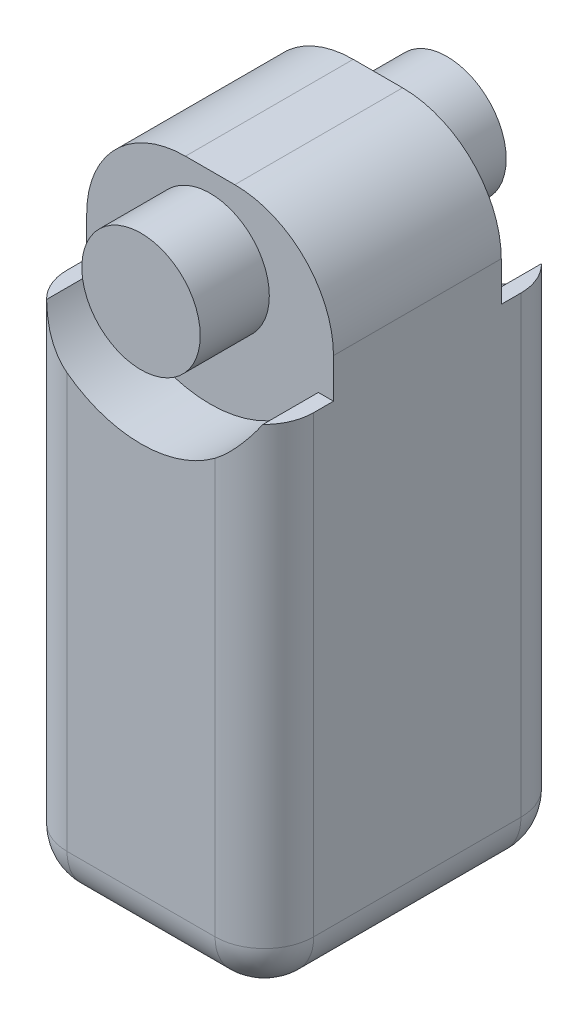
ISO-10303-21;
HEADER;
FILE_DESCRIPTION(('STEP AP214'),'2;1');
FILE_NAME('part.step','',(''),(''),'','','');
FILE_SCHEMA(('AUTOMOTIVE_DESIGN { 1 0 10303 214 1 1 1 1 }'));
ENDSEC;
DATA;
#1=APPLICATION_CONTEXT('core data for automotive mechanical design processes');
#2=APPLICATION_PROTOCOL_DEFINITION('international standard','automotive_design',2000,#1);
#3=PRODUCT_CONTEXT('',#1,'mechanical');
#4=PRODUCT('Part','Part','',(#3));
#5=PRODUCT_RELATED_PRODUCT_CATEGORY('part','',(#4));
#6=PRODUCT_DEFINITION_FORMATION('','',#4);
#7=PRODUCT_DEFINITION_CONTEXT('part definition',#1,'design');
#8=PRODUCT_DEFINITION('design','',#6,#7);
#9=PRODUCT_DEFINITION_SHAPE('','',#8);
#10=(LENGTH_UNIT() NAMED_UNIT(*) SI_UNIT(.MILLI.,.METRE.));
#11=(NAMED_UNIT(*) PLANE_ANGLE_UNIT() SI_UNIT($,.RADIAN.));
#12=(NAMED_UNIT(*) SI_UNIT($,.STERADIAN.) SOLID_ANGLE_UNIT());
#13=UNCERTAINTY_MEASURE_WITH_UNIT(LENGTH_MEASURE(1.E-05),#10,'distance_accuracy_value','');
#14=(GEOMETRIC_REPRESENTATION_CONTEXT(3) GLOBAL_UNCERTAINTY_ASSIGNED_CONTEXT((#13)) GLOBAL_UNIT_ASSIGNED_CONTEXT((#10,
#11,#12)) REPRESENTATION_CONTEXT('',''));
#15=CARTESIAN_POINT('',(0.,0.,0.));
#16=DIRECTION('',(0.,0.,1.));
#17=DIRECTION('',(1.,0.,0.));
#18=AXIS2_PLACEMENT_3D('',#15,#16,#17);
#19=CARTESIAN_POINT('',(-2.26904801141879,17.2601516919487,15.5));
#20=DIRECTION('',(0.,-1.,0.));
#21=DIRECTION('',(0.,0.,-1.));
#22=AXIS2_PLACEMENT_3D('',#19,#20,#21);
#23=PLANE('',#22);
#24=DIRECTION('',(1.,0.,0.));
#25=VECTOR('',#24,1.);
#26=CARTESIAN_POINT('',(-2.26904801141879,17.2601516919487,-8.5));
#27=LINE('',#26,#25);
#28=CARTESIAN_POINT('',(7.73095198858121,17.2601516919487,-8.5));
#29=VERTEX_POINT('',#28);
#30=CARTESIAN_POINT('',(12.7309519885812,17.2601516919487,-8.5));
#31=VERTEX_POINT('',#30);
#32=EDGE_CURVE('E224',#29,#31,#27,.T.);
#33=ORIENTED_EDGE('',*,*,#32,.F.);
#34=DIRECTION('',(0.,0.,-1.));
#35=VECTOR('',#34,1.);
#36=CARTESIAN_POINT('',(7.73095198858121,17.2601516919487,15.5));
#37=LINE('',#36,#35);
#38=CARTESIAN_POINT('',(7.73095198858121,17.2601516919487,8.5));
#39=VERTEX_POINT('',#38);
#40=EDGE_CURVE('E292',#29,#39,#37,.F.);
#41=ORIENTED_EDGE('',*,*,#40,.T.);
#42=DIRECTION('',(-1.,0.,0.));
#43=VECTOR('',#42,1.);
#44=CARTESIAN_POINT('',(-2.26904801141879,17.2601516919487,8.5));
#45=LINE('',#44,#43);
#46=CARTESIAN_POINT('',(12.7309519885812,17.2601516919487,8.5));
#47=VERTEX_POINT('',#46);
#48=EDGE_CURVE('E264',#47,#39,#45,.T.);
#49=ORIENTED_EDGE('',*,*,#48,.F.);
#50=DIRECTION('',(0.,0.,-1.));
#51=VECTOR('',#50,1.);
#52=CARTESIAN_POINT('',(12.7309519885812,17.2601516919487,15.5));
#53=LINE('',#52,#51);
#54=EDGE_CURVE('E288',#47,#31,#53,.T.);
#55=ORIENTED_EDGE('',*,*,#54,.T.);
#56=EDGE_LOOP('',(#33,#41,#49,#55));
#57=FACE_BOUND('',#56,.T.);
#58=ADVANCED_FACE('F47',(#57),#23,.F.);
#59=CARTESIAN_POINT('',(-2.26904801141879,17.2601516919487,15.5));
#60=DIRECTION('',(1.,0.,0.));
#61=DIRECTION('',(0.,1.,0.));
#62=AXIS2_PLACEMENT_3D('',#59,#60,#61);
#63=PLANE('',#62);
#64=DIRECTION('',(0.,-1.,0.));
#65=VECTOR('',#64,1.);
#66=CARTESIAN_POINT('',(-2.26904801141879,17.2601516919487,-10.5));
#67=LINE('',#66,#65);
#68=CARTESIAN_POINT('',(-2.26904801141879,3.26015169194865,-10.5));
#69=VERTEX_POINT('',#68);
#70=CARTESIAN_POINT('',(-2.26904801141879,-42.7398483080514,-10.5));
#71=VERTEX_POINT('',#70);
#72=EDGE_CURVE('E509',#69,#71,#67,.T.);
#73=ORIENTED_EDGE('',*,*,#72,.T.);
#74=DIRECTION('',(0.,0.,-1.));
#75=VECTOR('',#74,1.);
#76=CARTESIAN_POINT('',(-2.26904801141879,-42.7398483080514,15.5));
#77=LINE('',#76,#75);
#78=CARTESIAN_POINT('',(-2.26904801141879,-42.7398483080513,10.5));
#79=VERTEX_POINT('',#78);
#80=EDGE_CURVE('E11',#71,#79,#77,.F.);
#81=ORIENTED_EDGE('',*,*,#80,.T.);
#82=DIRECTION('',(0.,-1.,0.));
#83=VECTOR('',#82,1.);
#84=CARTESIAN_POINT('',(-2.26904801141879,3.26015169194865,10.5));
#85=LINE('',#84,#83);
#86=CARTESIAN_POINT('',(-2.26904801141879,3.26015169194865,10.5));
#87=VERTEX_POINT('',#86);
#88=EDGE_CURVE('E519',#79,#87,#85,.F.);
#89=ORIENTED_EDGE('',*,*,#88,.T.);
#90=DIRECTION('',(0.,0.,1.));
#91=VECTOR('',#90,1.);
#92=CARTESIAN_POINT('',(-2.26904801141879,3.26015169194865,8.5));
#93=LINE('',#92,#91);
#94=CARTESIAN_POINT('',(-2.26904801141879,3.26015169194865,8.5));
#95=VERTEX_POINT('',#94);
#96=EDGE_CURVE('E256',#95,#87,#93,.T.);
#97=ORIENTED_EDGE('',*,*,#96,.F.);
#98=DIRECTION('',(0.,-1.,0.));
#99=VECTOR('',#98,1.);
#100=CARTESIAN_POINT('',(-2.26904801141879,3.26015169194865,8.5));
#101=LINE('',#100,#99);
#102=CARTESIAN_POINT('',(-2.26904801141879,7.26015169194865,8.5));
#103=VERTEX_POINT('',#102);
#104=EDGE_CURVE('E237',#103,#95,#101,.T.);
#105=ORIENTED_EDGE('',*,*,#104,.F.);
#106=DIRECTION('',(0.,0.,-1.));
#107=VECTOR('',#106,1.);
#108=CARTESIAN_POINT('',(-2.26904801141879,7.26015169194865,15.5));
#109=LINE('',#108,#107);
#110=CARTESIAN_POINT('',(-2.26904801141879,7.26015169194865,-8.5));
#111=VERTEX_POINT('',#110);
#112=EDGE_CURVE('E279',#103,#111,#109,.T.);
#113=ORIENTED_EDGE('',*,*,#112,.T.);
#114=DIRECTION('',(0.,-1.,0.));
#115=VECTOR('',#114,1.);
#116=CARTESIAN_POINT('',(-2.26904801141879,3.26015169194865,-8.5));
#117=LINE('',#116,#115);
#118=CARTESIAN_POINT('',(-2.26904801141879,3.26015169194865,-8.5));
#119=VERTEX_POINT('',#118);
#120=EDGE_CURVE('E197',#111,#119,#117,.T.);
#121=ORIENTED_EDGE('',*,*,#120,.T.);
#122=DIRECTION('',(0.,0.,-1.));
#123=VECTOR('',#122,1.);
#124=CARTESIAN_POINT('',(-2.26904801141879,3.26015169194865,-8.5));
#125=LINE('',#124,#123);
#126=EDGE_CURVE('E228',#119,#69,#125,.T.);
#127=ORIENTED_EDGE('',*,*,#126,.T.);
#128=EDGE_LOOP('',(#73,#81,#89,#97,#105,#113,#121,#127));
#129=FACE_BOUND('',#128,.T.);
#130=ADVANCED_FACE('F373',(#129),#63,.F.);
#131=CARTESIAN_POINT('',(22.7309519885812,17.2601516919487,15.5));
#132=DIRECTION('',(-1.,0.,0.));
#133=DIRECTION('',(0.,-1.,0.));
#134=AXIS2_PLACEMENT_3D('',#131,#132,#133);
#135=PLANE('',#134);
#136=DIRECTION('',(0.,1.,0.));
#137=VECTOR('',#136,1.);
#138=CARTESIAN_POINT('',(22.7309519885812,-47.7398483080514,10.5));
#139=LINE('',#138,#137);
#140=CARTESIAN_POINT('',(22.7309519885812,3.26015169194865,10.5));
#141=VERTEX_POINT('',#140);
#142=CARTESIAN_POINT('',(22.7309519885812,-42.7398483080514,10.5));
#143=VERTEX_POINT('',#142);
#144=EDGE_CURVE('E304',#141,#143,#139,.F.);
#145=ORIENTED_EDGE('',*,*,#144,.T.);
#146=DIRECTION('',(0.,0.,-1.));
#147=VECTOR('',#146,1.);
#148=CARTESIAN_POINT('',(22.7309519885812,-42.7398483080514,15.5));
#149=LINE('',#148,#147);
#150=CARTESIAN_POINT('',(22.7309519885812,-42.7398483080514,-10.5));
#151=VERTEX_POINT('',#150);
#152=EDGE_CURVE('E545',#143,#151,#149,.T.);
#153=ORIENTED_EDGE('',*,*,#152,.T.);
#154=DIRECTION('',(0.,1.,0.));
#155=VECTOR('',#154,1.);
#156=CARTESIAN_POINT('',(22.7309519885812,17.2601516919487,-10.5));
#157=LINE('',#156,#155);
#158=CARTESIAN_POINT('',(22.7309519885812,3.26015169194865,-10.5));
#159=VERTEX_POINT('',#158);
#160=EDGE_CURVE('E212',#151,#159,#157,.T.);
#161=ORIENTED_EDGE('',*,*,#160,.T.);
#162=DIRECTION('',(0.,0.,-1.));
#163=VECTOR('',#162,1.);
#164=CARTESIAN_POINT('',(22.7309519885812,3.26015169194865,-8.5));
#165=LINE('',#164,#163);
#166=CARTESIAN_POINT('',(22.7309519885812,3.26015169194865,-8.5));
#167=VERTEX_POINT('',#166);
#168=EDGE_CURVE('E203',#167,#159,#165,.T.);
#169=ORIENTED_EDGE('',*,*,#168,.F.);
#170=DIRECTION('',(0.,1.,0.));
#171=VECTOR('',#170,1.);
#172=CARTESIAN_POINT('',(22.7309519885812,26.0583208976703,-8.5));
#173=LINE('',#172,#171);
#174=CARTESIAN_POINT('',(22.7309519885812,7.26015169194865,-8.5));
#175=VERTEX_POINT('',#174);
#176=EDGE_CURVE('E185',#167,#175,#173,.T.);
#177=ORIENTED_EDGE('',*,*,#176,.T.);
#178=DIRECTION('',(0.,0.,-1.));
#179=VECTOR('',#178,1.);
#180=CARTESIAN_POINT('',(22.7309519885812,7.26015169194865,15.5));
#181=LINE('',#180,#179);
#182=CARTESIAN_POINT('',(22.7309519885812,7.26015169194865,8.5));
#183=VERTEX_POINT('',#182);
#184=EDGE_CURVE('E301',#175,#183,#181,.F.);
#185=ORIENTED_EDGE('',*,*,#184,.T.);
#186=DIRECTION('',(0.,1.,0.));
#187=VECTOR('',#186,1.);
#188=CARTESIAN_POINT('',(22.7309519885812,9.26015169194865,8.5));
#189=LINE('',#188,#187);
#190=CARTESIAN_POINT('',(22.7309519885812,3.26015169194865,8.5));
#191=VERTEX_POINT('',#190);
#192=EDGE_CURVE('E252',#191,#183,#189,.T.);
#193=ORIENTED_EDGE('',*,*,#192,.F.);
#194=DIRECTION('',(0.,0.,1.));
#195=VECTOR('',#194,1.);
#196=CARTESIAN_POINT('',(22.7309519885812,3.26015169194865,8.5));
#197=LINE('',#196,#195);
#198=EDGE_CURVE('E260',#191,#141,#197,.T.);
#199=ORIENTED_EDGE('',*,*,#198,.T.);
#200=EDGE_LOOP('',(#145,#153,#161,#169,#177,#185,#193,#199));
#201=FACE_BOUND('',#200,.T.);
#202=ADVANCED_FACE('F210',(#201),#135,.F.);
#203=CARTESIAN_POINT('',(-2.26904801141879,-47.7398483080514,15.5));
#204=DIRECTION('',(0.,1.,0.));
#205=DIRECTION('',(0.,0.,1.));
#206=AXIS2_PLACEMENT_3D('',#203,#204,#205);
#207=PLANE('',#206);
#208=DIRECTION('',(0.,0.,-1.));
#209=VECTOR('',#208,1.);
#210=CARTESIAN_POINT('',(2.73095198858121,-47.7398483080514,15.5));
#211=LINE('',#210,#209);
#212=CARTESIAN_POINT('',(2.73095198858121,-47.7398483080514,10.5));
#213=VERTEX_POINT('',#212);
#214=CARTESIAN_POINT('',(2.73095198858121,-47.7398483080514,-10.5));
#215=VERTEX_POINT('',#214);
#216=EDGE_CURVE('E531',#213,#215,#211,.T.);
#217=ORIENTED_EDGE('',*,*,#216,.T.);
#218=DIRECTION('',(1.,0.,0.));
#219=VECTOR('',#218,1.);
#220=CARTESIAN_POINT('',(-2.26904801141879,-47.7398483080514,-10.5));
#221=LINE('',#220,#219);
#222=CARTESIAN_POINT('',(17.7309519885812,-47.7398483080514,-10.5));
#223=VERTEX_POINT('',#222);
#224=EDGE_CURVE('E539',#215,#223,#221,.T.);
#225=ORIENTED_EDGE('',*,*,#224,.T.);
#226=DIRECTION('',(0.,0.,-1.));
#227=VECTOR('',#226,1.);
#228=CARTESIAN_POINT('',(17.7309519885812,-47.7398483080514,15.5));
#229=LINE('',#228,#227);
#230=CARTESIAN_POINT('',(17.7309519885812,-47.7398483080514,10.5));
#231=VERTEX_POINT('',#230);
#232=EDGE_CURVE('E65',#223,#231,#229,.F.);
#233=ORIENTED_EDGE('',*,*,#232,.T.);
#234=DIRECTION('',(1.,0.,0.));
#235=VECTOR('',#234,1.);
#236=CARTESIAN_POINT('',(2.73095198858121,-47.7398483080514,10.5));
#237=LINE('',#236,#235);
#238=EDGE_CURVE('E534',#231,#213,#237,.F.);
#239=ORIENTED_EDGE('',*,*,#238,.T.);
#240=EDGE_LOOP('',(#217,#225,#233,#239));
#241=FACE_BOUND('',#240,.T.);
#242=CARTESIAN_POINT('',(10.2309519885812,-47.7398483080514,0.));
#243=DIRECTION('',(0.,-1.,0.));
#244=DIRECTION('',(0.,0.,-1.));
#245=AXIS2_PLACEMENT_3D('',#242,#243,#244);
#246=CIRCLE('',#245,5.);
#247=CARTESIAN_POINT('',(10.2309519885812,-47.7398483080514,-5.));
#248=VERTEX_POINT('',#247);
#249=EDGE_CURVE('E579',#248,#248,#246,.T.);
#250=ORIENTED_EDGE('',*,*,#249,.F.);
#251=EDGE_LOOP('',(#250));
#252=FACE_BOUND('',#251,.T.);
#253=ADVANCED_FACE('F390',(#241,#252),#207,.F.);
#254=CARTESIAN_POINT('',(0.,0.,15.5));
#255=DIRECTION('',(0.,0.,1.));
#256=DIRECTION('',(1.,0.,0.));
#257=AXIS2_PLACEMENT_3D('',#254,#255,#256);
#258=PLANE('',#257);
#259=DIRECTION('',(0.,-1.,0.));
#260=VECTOR('',#259,1.);
#261=CARTESIAN_POINT('',(2.73095198858121,-47.7398483080514,15.5));
#262=LINE('',#261,#260);
#263=CARTESIAN_POINT('',(2.73095198858121,-0.73984830805135,15.5));
#264=VERTEX_POINT('',#263);
#265=CARTESIAN_POINT('',(2.73095198858121,-42.7398483080514,15.5));
#266=VERTEX_POINT('',#265);
#267=EDGE_CURVE('E623',#264,#266,#262,.T.);
#268=ORIENTED_EDGE('',*,*,#267,.T.);
#269=DIRECTION('',(1.,0.,0.));
#270=VECTOR('',#269,1.);
#271=CARTESIAN_POINT('',(17.7309519885812,-42.7398483080514,15.5));
#272=LINE('',#271,#270);
#273=CARTESIAN_POINT('',(17.7309519885812,-42.7398483080514,15.5));
#274=VERTEX_POINT('',#273);
#275=EDGE_CURVE('E57',#266,#274,#272,.T.);
#276=ORIENTED_EDGE('',*,*,#275,.T.);
#277=DIRECTION('',(0.,1.,0.));
#278=VECTOR('',#277,1.);
#279=CARTESIAN_POINT('',(17.7309519885812,3.26015169194865,15.5));
#280=LINE('',#279,#278);
#281=CARTESIAN_POINT('',(17.7309519885812,-0.739848308051351,15.5));
#282=VERTEX_POINT('',#281);
#283=EDGE_CURVE('E627',#274,#282,#280,.T.);
#284=ORIENTED_EDGE('',*,*,#283,.T.);
#285=CARTESIAN_POINT('',(10.2309519885812,9.26015169194865,15.5));
#286=DIRECTION('',(0.,0.,1.));
#287=DIRECTION('',(1.,0.,0.));
#288=AXIS2_PLACEMENT_3D('',#285,#286,#287);
#289=CIRCLE('',#288,12.5);
#290=EDGE_CURVE('E233',#264,#282,#289,.T.);
#291=ORIENTED_EDGE('',*,*,#290,.F.);
#292=EDGE_LOOP('',(#268,#276,#284,#291));
#293=FACE_BOUND('',#292,.T.);
#294=ADVANCED_FACE('F392',(#293),#258,.T.);
#295=CARTESIAN_POINT('',(0.,0.,-15.5));
#296=DIRECTION('',(0.,0.,1.));
#297=DIRECTION('',(1.,0.,0.));
#298=AXIS2_PLACEMENT_3D('',#295,#296,#297);
#299=PLANE('',#298);
#300=DIRECTION('',(0.,1.,0.));
#301=VECTOR('',#300,1.);
#302=CARTESIAN_POINT('',(17.7309519885812,0.,-15.5));
#303=LINE('',#302,#301);
#304=CARTESIAN_POINT('',(17.7309519885812,-0.739848308051351,-15.5));
#305=VERTEX_POINT('',#304);
#306=CARTESIAN_POINT('',(17.7309519885812,-42.7398483080514,-15.5));
#307=VERTEX_POINT('',#306);
#308=EDGE_CURVE('E618',#305,#307,#303,.F.);
#309=ORIENTED_EDGE('',*,*,#308,.T.);
#310=DIRECTION('',(1.,0.,0.));
#311=VECTOR('',#310,1.);
#312=CARTESIAN_POINT('',(0.,-42.7398483080514,-15.5));
#313=LINE('',#312,#311);
#314=CARTESIAN_POINT('',(2.73095198858121,-42.7398483080514,-15.5));
#315=VERTEX_POINT('',#314);
#316=EDGE_CURVE('E542',#307,#315,#313,.F.);
#317=ORIENTED_EDGE('',*,*,#316,.T.);
#318=DIRECTION('',(0.,-1.,0.));
#319=VECTOR('',#318,1.);
#320=CARTESIAN_POINT('',(2.73095198858121,0.,-15.5));
#321=LINE('',#320,#319);
#322=CARTESIAN_POINT('',(2.73095198858121,-0.73984830805135,-15.5));
#323=VERTEX_POINT('',#322);
#324=EDGE_CURVE('E620',#315,#323,#321,.F.);
#325=ORIENTED_EDGE('',*,*,#324,.T.);
#326=CARTESIAN_POINT('',(10.2309519885812,9.26015169194865,-15.5));
#327=DIRECTION('',(0.,0.,1.));
#328=DIRECTION('',(1.,0.,0.));
#329=AXIS2_PLACEMENT_3D('',#326,#327,#328);
#330=CIRCLE('',#329,12.5);
#331=EDGE_CURVE('E486',#323,#305,#330,.T.);
#332=ORIENTED_EDGE('',*,*,#331,.T.);
#333=EDGE_LOOP('',(#309,#317,#325,#332));
#334=FACE_BOUND('',#333,.T.);
#335=ADVANCED_FACE('F386',(#334),#299,.F.);
#336=CARTESIAN_POINT('',(10.2309519885812,9.26015169194865,8.5));
#337=DIRECTION('',(0.,0.,1.));
#338=DIRECTION('',(1.,0.,0.));
#339=AXIS2_PLACEMENT_3D('',#336,#337,#338);
#340=PLANE('',#339);
#341=CARTESIAN_POINT('',(10.2309519885812,9.26015169194865,8.5));
#342=DIRECTION('',(0.,0.,1.));
#343=DIRECTION('',(1.,0.,0.));
#344=AXIS2_PLACEMENT_3D('',#341,#342,#343);
#345=CIRCLE('',#344,6.);
#346=CARTESIAN_POINT('',(16.2309519885812,9.26015169194865,8.5));
#347=VERTEX_POINT('',#346);
#348=EDGE_CURVE('E229',#347,#347,#345,.T.);
#349=ORIENTED_EDGE('',*,*,#348,.F.);
#350=EDGE_LOOP('',(#349));
#351=FACE_BOUND('',#350,.T.);
#352=ORIENTED_EDGE('',*,*,#48,.T.);
#353=CARTESIAN_POINT('',(7.73095198858121,7.26015169194865,8.5));
#354=DIRECTION('',(0.,0.,1.));
#355=DIRECTION('',(1.,0.,0.));
#356=AXIS2_PLACEMENT_3D('',#353,#354,#355);
#357=CIRCLE('',#356,10.);
#358=EDGE_CURVE('E298',#39,#103,#357,.T.);
#359=ORIENTED_EDGE('',*,*,#358,.T.);
#360=ORIENTED_EDGE('',*,*,#104,.T.);
#361=DIRECTION('',(1.,0.,0.));
#362=VECTOR('',#361,1.);
#363=CARTESIAN_POINT('',(-0.734904111149446,3.26015169194865,8.5));
#364=LINE('',#363,#362);
#365=CARTESIAN_POINT('',(-0.734904111149449,3.26015169194865,8.5));
#366=VERTEX_POINT('',#365);
#367=EDGE_CURVE('E240',#95,#366,#364,.T.);
#368=ORIENTED_EDGE('',*,*,#367,.T.);
#369=CARTESIAN_POINT('',(10.2309519885812,9.26015169194865,8.5));
#370=DIRECTION('',(0.,0.,1.));
#371=DIRECTION('',(1.,0.,0.));
#372=AXIS2_PLACEMENT_3D('',#369,#370,#371);
#373=CIRCLE('',#372,12.5);
#374=CARTESIAN_POINT('',(21.1968080883119,3.26015169194865,8.5));
#375=VERTEX_POINT('',#374);
#376=EDGE_CURVE('E244',#366,#375,#373,.T.);
#377=ORIENTED_EDGE('',*,*,#376,.T.);
#378=DIRECTION('',(1.,0.,0.));
#379=VECTOR('',#378,1.);
#380=CARTESIAN_POINT('',(21.1968080883119,3.26015169194865,8.5));
#381=LINE('',#380,#379);
#382=EDGE_CURVE('E248',#375,#191,#381,.T.);
#383=ORIENTED_EDGE('',*,*,#382,.T.);
#384=ORIENTED_EDGE('',*,*,#192,.T.);
#385=CARTESIAN_POINT('',(12.7309519885812,7.26015169194865,8.5));
#386=DIRECTION('',(0.,0.,1.));
#387=DIRECTION('',(1.,0.,0.));
#388=AXIS2_PLACEMENT_3D('',#385,#386,#387);
#389=CIRCLE('',#388,10.);
#390=EDGE_CURVE('E295',#183,#47,#389,.T.);
#391=ORIENTED_EDGE('',*,*,#390,.T.);
#392=EDGE_LOOP('',(#352,#359,#360,#368,#377,#383,#384,#391));
#393=FACE_BOUND('',#392,.T.);
#394=ADVANCED_FACE('F447',(#351,#393),#340,.T.);
#395=CARTESIAN_POINT('',(21.1968080883119,3.26015169194865,8.5));
#396=DIRECTION('',(0.,-1.,0.));
#397=DIRECTION('',(1.,0.,0.));
#398=AXIS2_PLACEMENT_3D('',#395,#396,#397);
#399=PLANE('',#398);
#400=DIRECTION('',(0.,0.,1.));
#401=VECTOR('',#400,1.);
#402=CARTESIAN_POINT('',(21.1968080883119,3.26015169194865,8.5));
#403=LINE('',#402,#401);
#404=CARTESIAN_POINT('',(21.1968080883119,3.26015169194865,14.1038647999002));
#405=VERTEX_POINT('',#404);
#406=EDGE_CURVE('E265',#375,#405,#403,.T.);
#407=ORIENTED_EDGE('',*,*,#406,.T.);
#408=CARTESIAN_POINT('',(17.7309519885812,3.26015169194866,10.5));
#409=DIRECTION('',(0.,-1.,0.));
#410=DIRECTION('',(1.,0.,0.));
#411=AXIS2_PLACEMENT_3D('',#408,#409,#410);
#412=CIRCLE('',#411,5.);
#413=EDGE_CURVE('E420',#405,#141,#412,.F.);
#414=ORIENTED_EDGE('',*,*,#413,.T.);
#415=ORIENTED_EDGE('',*,*,#198,.F.);
#416=ORIENTED_EDGE('',*,*,#382,.F.);
#417=EDGE_LOOP('',(#407,#414,#415,#416));
#418=FACE_BOUND('',#417,.T.);
#419=ADVANCED_FACE('F434',(#418),#399,.F.);
#420=CARTESIAN_POINT('',(10.2309519885812,9.26015169194865,8.5));
#421=DIRECTION('',(0.,0.,1.));
#422=DIRECTION('',(1.,0.,0.));
#423=AXIS2_PLACEMENT_3D('',#420,#421,#422);
#424=CYLINDRICAL_SURFACE('',#423,12.5);
#425=ORIENTED_EDGE('',*,*,#290,.T.);
#426=CARTESIAN_POINT('',(17.7309519885812,-0.739848308051351,15.5));
#427=CARTESIAN_POINT('',(17.9028657111832,-0.610960985776039,15.4999828755349));
#428=CARTESIAN_POINT('',(18.0712770610891,-0.477682002136304,15.491138700611));
#429=CARTESIAN_POINT('',(18.3998865141156,-0.203671002646157,15.4578006919092));
#430=CARTESIAN_POINT('',(18.5600971711247,-0.0629510926190514,15.4333316013247));
#431=CARTESIAN_POINT('',(18.8685622781914,0.222175459021305,15.3713551705557));
#432=CARTESIAN_POINT('',(19.0169906242361,0.36645398157947,15.3341155108864));
#433=CARTESIAN_POINT('',(19.3049507910813,0.660448855117111,15.2481694914543));
#434=CARTESIAN_POINT('',(19.4444790433822,0.810167349960862,15.199458568552));
#435=CARTESIAN_POINT('',(19.7382982894768,1.14118306341258,15.0825545351509));
#436=CARTESIAN_POINT('',(19.8908181226606,1.32337120608525,15.0124383170101));
#437=CARTESIAN_POINT('',(20.1830858857716,1.69307927639211,14.8605237426104));
#438=CARTESIAN_POINT('',(20.322829997323,1.88060077623362,14.7787219123831));
#439=CARTESIAN_POINT('',(20.5928694830174,2.26464497387595,14.6031711126768));
#440=CARTESIAN_POINT('',(20.7228521952353,2.46127566727419,14.5091798659315));
#441=CARTESIAN_POINT('',(20.9696151534859,2.85814975042957,14.3125897742888));
#442=CARTESIAN_POINT('',(21.0864094786853,3.05838901783615,14.2100003162166));
#443=CARTESIAN_POINT('',(21.1968080883119,3.26015169194865,14.1038647999002));
#444=B_SPLINE_CURVE_WITH_KNOTS('',3,(#426,#427,#428,#429,#430,#431,#432,#433,#434,#435,#436,
#437,#438,#439,#440,#441,#442,#443),.UNSPECIFIED.,.F.,.F.,(4,2,2,2,2,2,2,2,4),(0.,
0.644095798912307,1.28717414611181,1.91752274153295,2.54812250735104,3.29057271477558,
4.03324410334242,4.79398709869258,5.55391013323798),.UNSPECIFIED.);
#445=EDGE_CURVE('E411',#282,#405,#444,.T.);
#446=ORIENTED_EDGE('',*,*,#445,.T.);
#447=ORIENTED_EDGE('',*,*,#406,.F.);
#448=ORIENTED_EDGE('',*,*,#376,.F.);
#449=DIRECTION('',(0.,0.,1.));
#450=VECTOR('',#449,1.);
#451=CARTESIAN_POINT('',(-0.734904111149449,3.26015169194865,8.5));
#452=LINE('',#451,#450);
#453=CARTESIAN_POINT('',(-0.734904111149449,3.26015169194865,14.1038647999002));
#454=VERTEX_POINT('',#453);
#455=EDGE_CURVE('E269',#366,#454,#452,.T.);
#456=ORIENTED_EDGE('',*,*,#455,.T.);
#457=CARTESIAN_POINT('',(-0.734904111149449,3.26015169194865,14.1038647999002));
#458=CARTESIAN_POINT('',(-0.664705712995681,3.13185941377328,14.1713681302074));
#459=CARTESIAN_POINT('',(-0.591941583260451,3.00421484281127,14.2374047092213));
#460=CARTESIAN_POINT('',(-0.441163686342558,2.75033053402322,14.3662033088608));
#461=CARTESIAN_POINT('',(-0.363148534228552,2.62409117712738,14.4289644577977));
#462=CARTESIAN_POINT('',(-0.12060234544028,2.24696199889104,14.6121514152458));
#463=CARTESIAN_POINT('',(0.0519915898131605,1.9984655175919,14.7270538596911));
#464=CARTESIAN_POINT('',(0.413035849740727,1.51767101333754,14.9350053754254));
#465=CARTESIAN_POINT('',(0.600797031421717,1.28510905395408,15.028638783498));
#466=CARTESIAN_POINT('',(0.996507643548146,0.830106891615,15.1944232066898));
#467=CARTESIAN_POINT('',(1.20442363282779,0.607650792129381,15.2666090254339));
#468=CARTESIAN_POINT('',(1.52248183636125,0.291727458636152,15.3528781428856));
#469=CARTESIAN_POINT('',(1.62499449488806,0.193298210954408,15.3773187879947));
#470=CARTESIAN_POINT('',(1.83400646660916,-0.00060484706044812,15.4200471595691));
#471=CARTESIAN_POINT('',(1.94050496628008,-0.0960792532969858,15.4383361340821));
#472=CARTESIAN_POINT('',(2.15888379777229,-0.285154336227374,15.4684067678502));
#473=CARTESIAN_POINT('',(2.27082058072525,-0.37870609929797,15.4800877087215));
#474=CARTESIAN_POINT('',(2.49829232618128,-0.56213921142149,15.4958854535504));
#475=CARTESIAN_POINT('',(2.61382954179093,-0.652018177345829,15.499997420185));
#476=CARTESIAN_POINT('',(2.73095198858121,-0.73984830805135,15.5));
#477=B_SPLINE_CURVE_WITH_KNOTS('',3,(#457,#458,#459,#460,#461,#462,#463,#464,#465,#466,#467,
#468,#469,#470,#471,#472,#473,#474,#475,#476),.UNSPECIFIED.,.F.,.F.,(4,2,2,2,2,2,2,2,2,4),(0.,
0.483149075050468,0.966426081439507,1.93600277817453,2.87437294813641,3.81121197513922,
4.24364646779899,4.67599317539449,5.1147633970606,5.55381393905042),.UNSPECIFIED.);
#478=EDGE_CURVE('E421',#454,#264,#477,.T.);
#479=ORIENTED_EDGE('',*,*,#478,.T.);
#480=EDGE_LOOP('',(#425,#446,#447,#448,#456,#479));
#481=FACE_BOUND('',#480,.T.);
#482=ADVANCED_FACE('F428',(#481),#424,.F.);
#483=CARTESIAN_POINT('',(-0.734904111149446,3.26015169194865,8.5));
#484=DIRECTION('',(0.,-1.,0.));
#485=DIRECTION('',(1.,0.,0.));
#486=AXIS2_PLACEMENT_3D('',#483,#484,#485);
#487=PLANE('',#486);
#488=ORIENTED_EDGE('',*,*,#96,.T.);
#489=CARTESIAN_POINT('',(2.73095198858121,3.26015169194865,10.5));
#490=DIRECTION('',(0.,-1.,0.));
#491=DIRECTION('',(1.,0.,0.));
#492=AXIS2_PLACEMENT_3D('',#489,#490,#491);
#493=CIRCLE('',#492,5.);
#494=EDGE_CURVE('E512',#87,#454,#493,.F.);
#495=ORIENTED_EDGE('',*,*,#494,.T.);
#496=ORIENTED_EDGE('',*,*,#455,.F.);
#497=ORIENTED_EDGE('',*,*,#367,.F.);
#498=EDGE_LOOP('',(#488,#495,#496,#497));
#499=FACE_BOUND('',#498,.T.);
#500=ADVANCED_FACE('F433',(#499),#487,.F.);
#501=CARTESIAN_POINT('',(10.2309519885812,9.26015169194865,8.5));
#502=DIRECTION('',(0.,0.,1.));
#503=DIRECTION('',(1.,0.,0.));
#504=AXIS2_PLACEMENT_3D('',#501,#502,#503);
#505=CYLINDRICAL_SURFACE('',#504,6.);
#506=ORIENTED_EDGE('',*,*,#348,.T.);
#507=EDGE_LOOP('',(#506));
#508=FACE_BOUND('',#507,.T.);
#509=CARTESIAN_POINT('',(10.2309519885812,9.26015169194865,15.5));
#510=DIRECTION('',(0.,0.,1.));
#511=DIRECTION('',(1.,0.,0.));
#512=AXIS2_PLACEMENT_3D('',#509,#510,#511);
#513=CIRCLE('',#512,6.);
#514=CARTESIAN_POINT('',(16.2309519885812,9.26015169194865,15.5));
#515=VERTEX_POINT('',#514);
#516=EDGE_CURVE('E227',#515,#515,#513,.T.);
#517=ORIENTED_EDGE('',*,*,#516,.F.);
#518=EDGE_LOOP('',(#517));
#519=FACE_BOUND('',#518,.T.);
#520=ADVANCED_FACE('F439',(#508,#519),#505,.T.);
#521=ORIENTED_EDGE('',*,*,#516,.T.);
#522=EDGE_LOOP('',(#521));
#523=FACE_BOUND('',#522,.T.);
#524=ADVANCED_FACE('F443',(#523),#258,.T.);
#525=CARTESIAN_POINT('',(10.2309519885812,9.26015169194865,-8.5));
#526=DIRECTION('',(0.,0.,-1.));
#527=DIRECTION('',(1.,0.,0.));
#528=AXIS2_PLACEMENT_3D('',#525,#526,#527);
#529=PLANE('',#528);
#530=CARTESIAN_POINT('',(10.2309519885812,9.26015169194865,-8.5));
#531=DIRECTION('',(0.,0.,1.));
#532=DIRECTION('',(1.,0.,0.));
#533=AXIS2_PLACEMENT_3D('',#530,#531,#532);
#534=CIRCLE('',#533,6.);
#535=CARTESIAN_POINT('',(16.2309519885812,9.26015169194865,-8.5));
#536=VERTEX_POINT('',#535);
#537=EDGE_CURVE('E490',#536,#536,#534,.T.);
#538=ORIENTED_EDGE('',*,*,#537,.T.);
#539=EDGE_LOOP('',(#538));
#540=FACE_BOUND('',#539,.T.);
#541=ORIENTED_EDGE('',*,*,#120,.F.);
#542=CARTESIAN_POINT('',(7.73095198858121,7.26015169194865,-8.5));
#543=DIRECTION('',(0.,0.,-1.));
#544=DIRECTION('',(-1.,0.,0.));
#545=AXIS2_PLACEMENT_3D('',#542,#543,#544);
#546=CIRCLE('',#545,10.);
#547=EDGE_CURVE('E285',#111,#29,#546,.T.);
#548=ORIENTED_EDGE('',*,*,#547,.T.);
#549=ORIENTED_EDGE('',*,*,#32,.T.);
#550=CARTESIAN_POINT('',(12.7309519885812,7.26015169194865,-8.5));
#551=DIRECTION('',(0.,0.,-1.));
#552=DIRECTION('',(-1.,0.,0.));
#553=AXIS2_PLACEMENT_3D('',#550,#551,#552);
#554=CIRCLE('',#553,10.);
#555=EDGE_CURVE('E192',#31,#175,#554,.T.);
#556=ORIENTED_EDGE('',*,*,#555,.T.);
#557=ORIENTED_EDGE('',*,*,#176,.F.);
#558=DIRECTION('',(1.,0.,0.));
#559=VECTOR('',#558,1.);
#560=CARTESIAN_POINT('',(21.1968080883119,3.26015169194865,-8.5));
#561=LINE('',#560,#559);
#562=CARTESIAN_POINT('',(21.1968080883119,3.26015169194865,-8.5));
#563=VERTEX_POINT('',#562);
#564=EDGE_CURVE('E190',#563,#167,#561,.T.);
#565=ORIENTED_EDGE('',*,*,#564,.F.);
#566=CARTESIAN_POINT('',(10.2309519885812,9.26015169194865,-8.5));
#567=DIRECTION('',(0.,0.,1.));
#568=DIRECTION('',(1.,0.,0.));
#569=AXIS2_PLACEMENT_3D('',#566,#567,#568);
#570=CIRCLE('',#569,12.5);
#571=CARTESIAN_POINT('',(-0.734904111149449,3.26015169194865,-8.5));
#572=VERTEX_POINT('',#571);
#573=EDGE_CURVE('E207',#572,#563,#570,.T.);
#574=ORIENTED_EDGE('',*,*,#573,.F.);
#575=DIRECTION('',(1.,0.,0.));
#576=VECTOR('',#575,1.);
#577=CARTESIAN_POINT('',(-0.734904111149446,3.26015169194865,-8.5));
#578=LINE('',#577,#576);
#579=EDGE_CURVE('E215',#119,#572,#578,.T.);
#580=ORIENTED_EDGE('',*,*,#579,.F.);
#581=EDGE_LOOP('',(#541,#548,#549,#556,#557,#565,#574,#580));
#582=FACE_BOUND('',#581,.T.);
#583=ADVANCED_FACE('F188',(#540,#582),#529,.T.);
#584=CARTESIAN_POINT('',(-0.734904111149446,3.26015169194865,-8.5));
#585=DIRECTION('',(0.,1.,0.));
#586=DIRECTION('',(-1.,0.,0.));
#587=AXIS2_PLACEMENT_3D('',#584,#585,#586);
#588=PLANE('',#587);
#589=DIRECTION('',(0.,0.,-1.));
#590=VECTOR('',#589,1.);
#591=CARTESIAN_POINT('',(-0.734904111149449,3.26015169194865,-8.5));
#592=LINE('',#591,#590);
#593=CARTESIAN_POINT('',(-0.734904111149449,3.26015169194865,-14.1038647999002));
#594=VERTEX_POINT('',#593);
#595=EDGE_CURVE('E219',#572,#594,#592,.T.);
#596=ORIENTED_EDGE('',*,*,#595,.T.);
#597=CARTESIAN_POINT('',(2.73095198858121,3.26015169194865,-10.5));
#598=DIRECTION('',(0.,1.,0.));
#599=DIRECTION('',(-1.,0.,0.));
#600=AXIS2_PLACEMENT_3D('',#597,#598,#599);
#601=CIRCLE('',#600,5.);
#602=EDGE_CURVE('E504',#594,#69,#601,.T.);
#603=ORIENTED_EDGE('',*,*,#602,.T.);
#604=ORIENTED_EDGE('',*,*,#126,.F.);
#605=ORIENTED_EDGE('',*,*,#579,.T.);
#606=EDGE_LOOP('',(#596,#603,#604,#605));
#607=FACE_BOUND('',#606,.T.);
#608=ADVANCED_FACE('F457',(#607),#588,.T.);
#609=CARTESIAN_POINT('',(10.2309519885812,9.26015169194865,-8.5));
#610=DIRECTION('',(0.,0.,-1.));
#611=DIRECTION('',(-1.,0.,0.));
#612=AXIS2_PLACEMENT_3D('',#609,#610,#611);
#613=CYLINDRICAL_SURFACE('',#612,12.5);
#614=DIRECTION('',(0.,0.,-1.));
#615=VECTOR('',#614,1.);
#616=CARTESIAN_POINT('',(21.1968080883119,3.26015169194865,-8.5));
#617=LINE('',#616,#615);
#618=CARTESIAN_POINT('',(21.1968080883119,3.26015169194865,-14.1038647999002));
#619=VERTEX_POINT('',#618);
#620=EDGE_CURVE('E205',#563,#619,#617,.T.);
#621=ORIENTED_EDGE('',*,*,#620,.T.);
#622=CARTESIAN_POINT('',(21.1968080883119,3.26015169194865,-14.1038647999002));
#623=CARTESIAN_POINT('',(21.1266096901581,3.13185941377328,-14.1713681302074));
#624=CARTESIAN_POINT('',(21.0538455604229,3.00421484281127,-14.2374047092213));
#625=CARTESIAN_POINT('',(20.903067663505,2.75033053402322,-14.3662033088608));
#626=CARTESIAN_POINT('',(20.825052511391,2.62409117712738,-14.4289644577977));
#627=CARTESIAN_POINT('',(20.5825063226027,2.24696199889104,-14.6121514152458));
#628=CARTESIAN_POINT('',(20.4099123873493,1.9984655175919,-14.7270538596911));
#629=CARTESIAN_POINT('',(20.0488681274217,1.51767101333754,-14.9350053754254));
#630=CARTESIAN_POINT('',(19.8611069457407,1.28510905395408,-15.028638783498));
#631=CARTESIAN_POINT('',(19.4653963336143,0.830106891614999,-15.1944232066898));
#632=CARTESIAN_POINT('',(19.2574803443346,0.607650792129382,-15.2666090254339));
#633=CARTESIAN_POINT('',(18.9394221408012,0.291727458636151,-15.3528781428856));
#634=CARTESIAN_POINT('',(18.8369094822744,0.193298210954407,-15.3773187879947));
#635=CARTESIAN_POINT('',(18.6278975105533,-0.000604847060449435,-15.4200471595691));
#636=CARTESIAN_POINT('',(18.5213990108823,-0.0960792532969864,-15.4383361340821));
#637=CARTESIAN_POINT('',(18.3030201793901,-0.285154336227375,-15.4684067678502));
#638=CARTESIAN_POINT('',(18.1910833964372,-0.378706099297972,-15.4800877087215));
#639=CARTESIAN_POINT('',(17.9636116509811,-0.562139211421494,-15.4958854535504));
#640=CARTESIAN_POINT('',(17.8480744353715,-0.652018177345833,-15.499997420185));
#641=CARTESIAN_POINT('',(17.7309519885812,-0.739848308051352,-15.5));
#642=B_SPLINE_CURVE_WITH_KNOTS('',3,(#622,#623,#624,#625,#626,#627,#628,#629,#630,#631,#632,
#633,#634,#635,#636,#637,#638,#639,#640,#641),.UNSPECIFIED.,.F.,.F.,(4,2,2,2,2,2,2,2,2,4),(0.,
0.483149075050468,0.966426081439503,1.93600277817453,2.87437294813641,3.81121197513922,
4.24364646779899,4.67599317539449,5.1147633970606,5.55381393905043),.UNSPECIFIED.);
#643=EDGE_CURVE('E321',#619,#305,#642,.T.);
#644=ORIENTED_EDGE('',*,*,#643,.T.);
#645=ORIENTED_EDGE('',*,*,#331,.F.);
#646=CARTESIAN_POINT('',(2.73095198858121,-0.739848308051348,-15.5));
#647=CARTESIAN_POINT('',(2.55903826597919,-0.610960985776034,-15.4999828755349));
#648=CARTESIAN_POINT('',(2.39062691607332,-0.477682002136299,-15.491138700611));
#649=CARTESIAN_POINT('',(2.06201746304678,-0.203671002646153,-15.4578006919092));
#650=CARTESIAN_POINT('',(1.90180680603771,-0.0629510926190477,-15.4333316013247));
#651=CARTESIAN_POINT('',(1.59334169897104,0.222175459021308,-15.3713551705557));
#652=CARTESIAN_POINT('',(1.44491335292636,0.366453981579474,-15.3341155108864));
#653=CARTESIAN_POINT('',(1.15695318608106,0.660448855117114,-15.2481694914543));
#654=CARTESIAN_POINT('',(1.01742493378018,0.810167349960864,-15.199458568552));
#655=CARTESIAN_POINT('',(0.723605687685621,1.14118306341258,-15.0825545351509));
#656=CARTESIAN_POINT('',(0.571085854501828,1.32337120608525,-15.0124383170101));
#657=CARTESIAN_POINT('',(0.278818091390807,1.69307927639211,-14.8605237426104));
#658=CARTESIAN_POINT('',(0.139073979839373,1.88060077623362,-14.7787219123831));
#659=CARTESIAN_POINT('',(-0.130965505854974,2.26464497387595,-14.6031711126768));
#660=CARTESIAN_POINT('',(-0.260948218072918,2.46127566727419,-14.5091798659315));
#661=CARTESIAN_POINT('',(-0.507711176323438,2.85814975042957,-14.3125897742888));
#662=CARTESIAN_POINT('',(-0.624505501522918,3.05838901783615,-14.2100003162166));
#663=CARTESIAN_POINT('',(-0.734904111149449,3.26015169194865,-14.1038647999002));
#664=B_SPLINE_CURVE_WITH_KNOTS('',3,(#646,#647,#648,#649,#650,#651,#652,#653,#654,#655,#656,
#657,#658,#659,#660,#661,#662,#663),.UNSPECIFIED.,.F.,.F.,(4,2,2,2,2,2,2,2,4),(0.,
0.644095798912308,1.28717414611181,1.91752274153296,2.54812250735104,3.29057271477558,
4.03324410334242,4.79398709869258,5.55391013323798),.UNSPECIFIED.);
#665=EDGE_CURVE('E312',#323,#594,#664,.T.);
#666=ORIENTED_EDGE('',*,*,#665,.T.);
#667=ORIENTED_EDGE('',*,*,#595,.F.);
#668=ORIENTED_EDGE('',*,*,#573,.T.);
#669=EDGE_LOOP('',(#621,#644,#645,#666,#667,#668));
#670=FACE_BOUND('',#669,.T.);
#671=ADVANCED_FACE('F328',(#670),#613,.F.);
#672=CARTESIAN_POINT('',(21.1968080883119,3.26015169194865,-8.5));
#673=DIRECTION('',(0.,1.,0.));
#674=DIRECTION('',(-1.,0.,0.));
#675=AXIS2_PLACEMENT_3D('',#672,#673,#674);
#676=PLANE('',#675);
#677=ORIENTED_EDGE('',*,*,#168,.T.);
#678=CARTESIAN_POINT('',(17.7309519885812,3.26015169194866,-10.5));
#679=DIRECTION('',(0.,1.,0.));
#680=DIRECTION('',(-1.,0.,0.));
#681=AXIS2_PLACEMENT_3D('',#678,#679,#680);
#682=CIRCLE('',#681,5.);
#683=EDGE_CURVE('E309',#159,#619,#682,.T.);
#684=ORIENTED_EDGE('',*,*,#683,.T.);
#685=ORIENTED_EDGE('',*,*,#620,.F.);
#686=ORIENTED_EDGE('',*,*,#564,.T.);
#687=EDGE_LOOP('',(#677,#684,#685,#686));
#688=FACE_BOUND('',#687,.T.);
#689=ADVANCED_FACE('F202',(#688),#676,.T.);
#690=CARTESIAN_POINT('',(10.2309519885812,9.26015169194865,-8.5));
#691=DIRECTION('',(0.,0.,-1.));
#692=DIRECTION('',(-1.,0.,0.));
#693=AXIS2_PLACEMENT_3D('',#690,#691,#692);
#694=CYLINDRICAL_SURFACE('',#693,6.);
#695=ORIENTED_EDGE('',*,*,#537,.F.);
#696=EDGE_LOOP('',(#695));
#697=FACE_BOUND('',#696,.T.);
#698=CARTESIAN_POINT('',(10.2309519885812,9.26015169194865,-15.5));
#699=DIRECTION('',(0.,0.,1.));
#700=DIRECTION('',(1.,0.,0.));
#701=AXIS2_PLACEMENT_3D('',#698,#699,#700);
#702=CIRCLE('',#701,6.);
#703=CARTESIAN_POINT('',(16.2309519885812,9.26015169194865,-15.5));
#704=VERTEX_POINT('',#703);
#705=EDGE_CURVE('E493',#704,#704,#702,.T.);
#706=ORIENTED_EDGE('',*,*,#705,.T.);
#707=EDGE_LOOP('',(#706));
#708=FACE_BOUND('',#707,.T.);
#709=ADVANCED_FACE('F597',(#697,#708),#694,.T.);
#710=ORIENTED_EDGE('',*,*,#705,.F.);
#711=EDGE_LOOP('',(#710));
#712=FACE_BOUND('',#711,.T.);
#713=ADVANCED_FACE('F398',(#712),#299,.F.);
#714=CARTESIAN_POINT('',(7.73095198858121,7.26015169194865,15.5));
#715=DIRECTION('',(0.,0.,-1.));
#716=DIRECTION('',(-1.,0.,0.));
#717=AXIS2_PLACEMENT_3D('',#714,#715,#716);
#718=CYLINDRICAL_SURFACE('',#717,10.);
#719=ORIENTED_EDGE('',*,*,#358,.F.);
#720=ORIENTED_EDGE('',*,*,#40,.F.);
#721=ORIENTED_EDGE('',*,*,#547,.F.);
#722=ORIENTED_EDGE('',*,*,#112,.F.);
#723=EDGE_LOOP('',(#719,#720,#721,#722));
#724=FACE_BOUND('',#723,.T.);
#725=ADVANCED_FACE('F394',(#724),#718,.T.);
#726=CARTESIAN_POINT('',(12.7309519885812,7.26015169194865,15.5));
#727=DIRECTION('',(0.,0.,-1.));
#728=DIRECTION('',(-1.,0.,0.));
#729=AXIS2_PLACEMENT_3D('',#726,#727,#728);
#730=CYLINDRICAL_SURFACE('',#729,10.);
#731=ORIENTED_EDGE('',*,*,#390,.F.);
#732=ORIENTED_EDGE('',*,*,#184,.F.);
#733=ORIENTED_EDGE('',*,*,#555,.F.);
#734=ORIENTED_EDGE('',*,*,#54,.F.);
#735=EDGE_LOOP('',(#731,#732,#733,#734));
#736=FACE_BOUND('',#735,.T.);
#737=ADVANCED_FACE('F397',(#736),#730,.T.);
#738=CARTESIAN_POINT('',(17.7309519885812,17.2601516919487,-10.5));
#739=DIRECTION('',(0.,1.,0.));
#740=DIRECTION('',(-1.,0.,0.));
#741=AXIS2_PLACEMENT_3D('',#738,#739,#740);
#742=CYLINDRICAL_SURFACE('',#741,5.);
#743=ORIENTED_EDGE('',*,*,#160,.F.);
#744=CARTESIAN_POINT('',(17.7309519885812,-42.7398483080514,-10.5));
#745=DIRECTION('',(0.,1.,0.));
#746=DIRECTION('',(-1.,0.,0.));
#747=AXIS2_PLACEMENT_3D('',#744,#745,#746);
#748=CIRCLE('',#747,5.);
#749=EDGE_CURVE('E525',#151,#307,#748,.T.);
#750=ORIENTED_EDGE('',*,*,#749,.T.);
#751=ORIENTED_EDGE('',*,*,#308,.F.);
#752=ORIENTED_EDGE('',*,*,#643,.F.);
#753=ORIENTED_EDGE('',*,*,#683,.F.);
#754=EDGE_LOOP('',(#743,#750,#751,#752,#753));
#755=FACE_BOUND('',#754,.T.);
#756=ADVANCED_FACE('F401',(#755),#742,.T.);
#757=CARTESIAN_POINT('',(17.7309519885812,0.,10.5));
#758=DIRECTION('',(0.,-1.,0.));
#759=DIRECTION('',(1.,0.,0.));
#760=AXIS2_PLACEMENT_3D('',#757,#758,#759);
#761=CYLINDRICAL_SURFACE('',#760,5.);
#762=ORIENTED_EDGE('',*,*,#283,.F.);
#763=CARTESIAN_POINT('',(17.7309519885812,-42.7398483080514,10.5));
#764=DIRECTION('',(0.,-1.,0.));
#765=DIRECTION('',(1.,0.,0.));
#766=AXIS2_PLACEMENT_3D('',#763,#764,#765);
#767=CIRCLE('',#766,5.);
#768=EDGE_CURVE('E517',#274,#143,#767,.F.);
#769=ORIENTED_EDGE('',*,*,#768,.T.);
#770=ORIENTED_EDGE('',*,*,#144,.F.);
#771=ORIENTED_EDGE('',*,*,#413,.F.);
#772=ORIENTED_EDGE('',*,*,#445,.F.);
#773=EDGE_LOOP('',(#762,#769,#770,#771,#772));
#774=FACE_BOUND('',#773,.T.);
#775=ADVANCED_FACE('F405',(#774),#761,.T.);
#776=CARTESIAN_POINT('',(2.73095198858121,0.,10.5));
#777=DIRECTION('',(0.,1.,0.));
#778=DIRECTION('',(-1.,0.,0.));
#779=AXIS2_PLACEMENT_3D('',#776,#777,#778);
#780=CYLINDRICAL_SURFACE('',#779,5.);
#781=ORIENTED_EDGE('',*,*,#88,.F.);
#782=CARTESIAN_POINT('',(2.73095198858121,-42.7398483080514,10.5));
#783=DIRECTION('',(0.,1.,0.));
#784=DIRECTION('',(-1.,0.,0.));
#785=AXIS2_PLACEMENT_3D('',#782,#783,#784);
#786=CIRCLE('',#785,5.);
#787=EDGE_CURVE('E511',#79,#266,#786,.T.);
#788=ORIENTED_EDGE('',*,*,#787,.T.);
#789=ORIENTED_EDGE('',*,*,#267,.F.);
#790=ORIENTED_EDGE('',*,*,#478,.F.);
#791=ORIENTED_EDGE('',*,*,#494,.F.);
#792=EDGE_LOOP('',(#781,#788,#789,#790,#791));
#793=FACE_BOUND('',#792,.T.);
#794=ADVANCED_FACE('F338',(#793),#780,.T.);
#795=CARTESIAN_POINT('',(2.73095198858121,17.2601516919487,-10.5));
#796=DIRECTION('',(0.,-1.,0.));
#797=DIRECTION('',(1.,0.,0.));
#798=AXIS2_PLACEMENT_3D('',#795,#796,#797);
#799=CYLINDRICAL_SURFACE('',#798,5.);
#800=ORIENTED_EDGE('',*,*,#324,.F.);
#801=CARTESIAN_POINT('',(2.73095198858121,-42.7398483080514,-10.5));
#802=DIRECTION('',(0.,-1.,0.));
#803=DIRECTION('',(1.,0.,0.));
#804=AXIS2_PLACEMENT_3D('',#801,#802,#803);
#805=CIRCLE('',#804,5.);
#806=EDGE_CURVE('E528',#315,#71,#805,.F.);
#807=ORIENTED_EDGE('',*,*,#806,.T.);
#808=ORIENTED_EDGE('',*,*,#72,.F.);
#809=ORIENTED_EDGE('',*,*,#602,.F.);
#810=ORIENTED_EDGE('',*,*,#665,.F.);
#811=EDGE_LOOP('',(#800,#807,#808,#809,#810));
#812=FACE_BOUND('',#811,.T.);
#813=ADVANCED_FACE('F332',(#812),#799,.T.);
#814=CARTESIAN_POINT('',(10.2309519885812,-42.2398483080514,0.));
#815=DIRECTION('',(0.,-1.,0.));
#816=DIRECTION('',(0.,0.,-1.));
#817=AXIS2_PLACEMENT_3D('',#814,#815,#816);
#818=CYLINDRICAL_SURFACE('',#817,5.);
#819=CARTESIAN_POINT('',(10.2309519885812,-42.2398483080514,0.));
#820=DIRECTION('',(0.,-1.,0.));
#821=DIRECTION('',(0.,0.,-1.));
#822=AXIS2_PLACEMENT_3D('',#819,#820,#821);
#823=CIRCLE('',#822,5.);
#824=CARTESIAN_POINT('',(10.2309519885812,-42.2398483080514,-5.));
#825=VERTEX_POINT('',#824);
#826=EDGE_CURVE('E583',#825,#825,#823,.T.);
#827=ORIENTED_EDGE('',*,*,#826,.F.);
#828=EDGE_LOOP('',(#827));
#829=FACE_BOUND('',#828,.T.);
#830=ORIENTED_EDGE('',*,*,#249,.T.);
#831=EDGE_LOOP('',(#830));
#832=FACE_BOUND('',#831,.T.);
#833=ADVANCED_FACE('F337',(#829,#832),#818,.F.);
#834=CARTESIAN_POINT('',(10.2309519885812,-42.2398483080514,0.));
#835=DIRECTION('',(0.,-1.,0.));
#836=DIRECTION('',(0.,0.,-1.));
#837=AXIS2_PLACEMENT_3D('',#834,#835,#836);
#838=PLANE('',#837);
#839=ORIENTED_EDGE('',*,*,#826,.T.);
#840=EDGE_LOOP('',(#839));
#841=FACE_BOUND('',#840,.T.);
#842=ADVANCED_FACE('F370',(#841),#838,.T.);
#843=CARTESIAN_POINT('',(17.7309519885812,-42.7398483080514,-10.5));
#844=DIRECTION('',(0.,1.,0.));
#845=DIRECTION('',(0.,0.,1.));
#846=AXIS2_PLACEMENT_3D('',#843,#844,#845);
#847=SPHERICAL_SURFACE('',#846,5.);
#848=CARTESIAN_POINT('',(17.7309519885812,-42.7398483080514,-10.5));
#849=DIRECTION('',(-1.,0.,0.));
#850=DIRECTION('',(0.,0.,1.));
#851=AXIS2_PLACEMENT_3D('',#848,#849,#850);
#852=CIRCLE('',#851,5.);
#853=EDGE_CURVE('E572',#307,#223,#852,.T.);
#854=ORIENTED_EDGE('',*,*,#853,.F.);
#855=ORIENTED_EDGE('',*,*,#749,.F.);
#856=CARTESIAN_POINT('',(17.7309519885812,-42.7398483080514,-10.5));
#857=DIRECTION('',(0.,0.,1.));
#858=DIRECTION('',(1.,0.,0.));
#859=AXIS2_PLACEMENT_3D('',#856,#857,#858);
#860=CIRCLE('',#859,5.);
#861=EDGE_CURVE('E51',#223,#151,#860,.T.);
#862=ORIENTED_EDGE('',*,*,#861,.F.);
#863=EDGE_LOOP('',(#854,#855,#862));
#864=FACE_BOUND('',#863,.T.);
#865=ADVANCED_FACE('F49',(#864),#847,.T.);
#866=CARTESIAN_POINT('',(17.7309519885812,-42.7398483080514,15.5));
#867=DIRECTION('',(0.,0.,-1.));
#868=DIRECTION('',(-1.,0.,0.));
#869=AXIS2_PLACEMENT_3D('',#866,#867,#868);
#870=CYLINDRICAL_SURFACE('',#869,5.);
#871=ORIENTED_EDGE('',*,*,#861,.T.);
#872=ORIENTED_EDGE('',*,*,#152,.F.);
#873=CARTESIAN_POINT('',(17.7309519885812,-42.7398483080514,10.5));
#874=DIRECTION('',(0.,0.,1.));
#875=DIRECTION('',(1.,0.,0.));
#876=AXIS2_PLACEMENT_3D('',#873,#874,#875);
#877=CIRCLE('',#876,5.);
#878=EDGE_CURVE('E569',#231,#143,#877,.T.);
#879=ORIENTED_EDGE('',*,*,#878,.F.);
#880=ORIENTED_EDGE('',*,*,#232,.F.);
#881=EDGE_LOOP('',(#871,#872,#879,#880));
#882=FACE_BOUND('',#881,.T.);
#883=ADVANCED_FACE('F364',(#882),#870,.T.);
#884=CARTESIAN_POINT('',(-2.26904801141879,-42.7398483080514,-10.5));
#885=DIRECTION('',(1.,0.,0.));
#886=DIRECTION('',(0.,0.,-1.));
#887=AXIS2_PLACEMENT_3D('',#884,#885,#886);
#888=CYLINDRICAL_SURFACE('',#887,5.);
#889=ORIENTED_EDGE('',*,*,#853,.T.);
#890=ORIENTED_EDGE('',*,*,#224,.F.);
#891=CARTESIAN_POINT('',(2.73095198858121,-42.7398483080514,-10.5));
#892=DIRECTION('',(-1.,0.,0.));
#893=DIRECTION('',(0.,0.,1.));
#894=AXIS2_PLACEMENT_3D('',#891,#892,#893);
#895=CIRCLE('',#894,5.);
#896=EDGE_CURVE('E565',#315,#215,#895,.T.);
#897=ORIENTED_EDGE('',*,*,#896,.F.);
#898=ORIENTED_EDGE('',*,*,#316,.F.);
#899=EDGE_LOOP('',(#889,#890,#897,#898));
#900=FACE_BOUND('',#899,.T.);
#901=ADVANCED_FACE('F361',(#900),#888,.T.);
#902=CARTESIAN_POINT('',(17.7309519885812,-42.7398483080514,10.5));
#903=DIRECTION('',(0.,1.,0.));
#904=DIRECTION('',(0.,0.,1.));
#905=AXIS2_PLACEMENT_3D('',#902,#903,#904);
#906=SPHERICAL_SURFACE('',#905,5.);
#907=ORIENTED_EDGE('',*,*,#878,.T.);
#908=ORIENTED_EDGE('',*,*,#768,.F.);
#909=CARTESIAN_POINT('',(17.7309519885812,-42.7398483080514,10.5));
#910=DIRECTION('',(-1.,0.,0.));
#911=DIRECTION('',(0.,0.,1.));
#912=AXIS2_PLACEMENT_3D('',#909,#910,#911);
#913=CIRCLE('',#912,5.);
#914=EDGE_CURVE('E561',#231,#274,#913,.T.);
#915=ORIENTED_EDGE('',*,*,#914,.F.);
#916=EDGE_LOOP('',(#907,#908,#915));
#917=FACE_BOUND('',#916,.T.);
#918=ADVANCED_FACE('F357',(#917),#906,.T.);
#919=CARTESIAN_POINT('',(2.73095198858121,-42.7398483080514,-10.5));
#920=DIRECTION('',(0.,1.,0.));
#921=DIRECTION('',(0.,0.,1.));
#922=AXIS2_PLACEMENT_3D('',#919,#920,#921);
#923=SPHERICAL_SURFACE('',#922,5.);
#924=ORIENTED_EDGE('',*,*,#806,.F.);
#925=ORIENTED_EDGE('',*,*,#896,.T.);
#926=CARTESIAN_POINT('',(2.73095198858121,-42.7398483080514,-10.5));
#927=DIRECTION('',(0.,0.,1.));
#928=DIRECTION('',(1.,0.,0.));
#929=AXIS2_PLACEMENT_3D('',#926,#927,#928);
#930=CIRCLE('',#929,5.);
#931=EDGE_CURVE('E557',#71,#215,#930,.T.);
#932=ORIENTED_EDGE('',*,*,#931,.F.);
#933=EDGE_LOOP('',(#924,#925,#932));
#934=FACE_BOUND('',#933,.T.);
#935=ADVANCED_FACE('F353',(#934),#923,.T.);
#936=CARTESIAN_POINT('',(0.,-42.7398483080514,10.5));
#937=DIRECTION('',(-1.,0.,0.));
#938=DIRECTION('',(0.,0.,1.));
#939=AXIS2_PLACEMENT_3D('',#936,#937,#938);
#940=CYLINDRICAL_SURFACE('',#939,5.);
#941=ORIENTED_EDGE('',*,*,#914,.T.);
#942=ORIENTED_EDGE('',*,*,#275,.F.);
#943=CARTESIAN_POINT('',(2.73095198858121,-42.7398483080514,10.5));
#944=DIRECTION('',(-1.,0.,0.));
#945=DIRECTION('',(0.,0.,1.));
#946=AXIS2_PLACEMENT_3D('',#943,#944,#945);
#947=CIRCLE('',#946,5.);
#948=EDGE_CURVE('E554',#213,#266,#947,.T.);
#949=ORIENTED_EDGE('',*,*,#948,.F.);
#950=ORIENTED_EDGE('',*,*,#238,.F.);
#951=EDGE_LOOP('',(#941,#942,#949,#950));
#952=FACE_BOUND('',#951,.T.);
#953=ADVANCED_FACE('F349',(#952),#940,.T.);
#954=CARTESIAN_POINT('',(2.73095198858121,-42.7398483080514,15.5));
#955=DIRECTION('',(0.,0.,-1.));
#956=DIRECTION('',(-1.,0.,0.));
#957=AXIS2_PLACEMENT_3D('',#954,#955,#956);
#958=CYLINDRICAL_SURFACE('',#957,5.);
#959=ORIENTED_EDGE('',*,*,#931,.T.);
#960=ORIENTED_EDGE('',*,*,#216,.F.);
#961=CARTESIAN_POINT('',(2.73095198858121,-42.7398483080514,10.5));
#962=DIRECTION('',(0.,0.,1.));
#963=DIRECTION('',(1.,0.,0.));
#964=AXIS2_PLACEMENT_3D('',#961,#962,#963);
#965=CIRCLE('',#964,5.);
#966=EDGE_CURVE('E550',#79,#213,#965,.T.);
#967=ORIENTED_EDGE('',*,*,#966,.F.);
#968=ORIENTED_EDGE('',*,*,#80,.F.);
#969=EDGE_LOOP('',(#959,#960,#967,#968));
#970=FACE_BOUND('',#969,.T.);
#971=ADVANCED_FACE('F345',(#970),#958,.T.);
#972=CARTESIAN_POINT('',(2.73095198858121,-42.7398483080514,10.5));
#973=DIRECTION('',(0.,1.,0.));
#974=DIRECTION('',(0.,0.,1.));
#975=AXIS2_PLACEMENT_3D('',#972,#973,#974);
#976=SPHERICAL_SURFACE('',#975,5.);
#977=ORIENTED_EDGE('',*,*,#948,.T.);
#978=ORIENTED_EDGE('',*,*,#787,.F.);
#979=ORIENTED_EDGE('',*,*,#966,.T.);
#980=EDGE_LOOP('',(#977,#978,#979));
#981=FACE_BOUND('',#980,.T.);
#982=ADVANCED_FACE('F342',(#981),#976,.T.);
#983=CLOSED_SHELL('',(#58,#130,#202,#253,#294,#335,#394,#419,#482,#500,#520,#524,#583,#608,#671,
#689,#709,#713,#725,#737,#756,#775,#794,#813,#833,#842,#865,#883,#901,#918,#935,#953,#971,#982));
#984=MANIFOLD_SOLID_BREP('B2',#983);
#985=ADVANCED_BREP_SHAPE_REPRESENTATION('',(#18,#984),#14);
#986=SHAPE_DEFINITION_REPRESENTATION(#9,#985);
ENDSEC;
END-ISO-10303-21;
